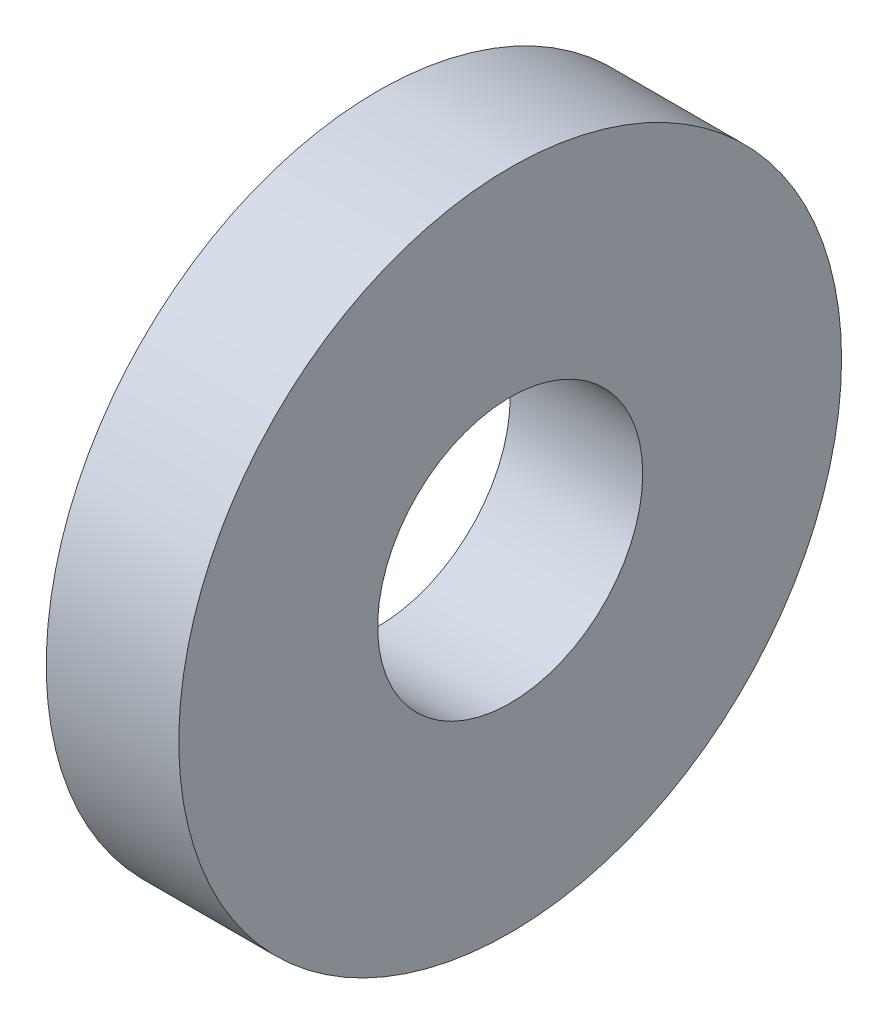
ISO-10303-21;
HEADER;
FILE_DESCRIPTION(('STEP AP214'),'2;1');
FILE_NAME('part.step','',(''),(''),'','','');
FILE_SCHEMA(('AUTOMOTIVE_DESIGN { 1 0 10303 214 1 1 1 1 }'));
ENDSEC;
DATA;
#1=APPLICATION_CONTEXT('core data for automotive mechanical design processes');
#2=APPLICATION_PROTOCOL_DEFINITION('international standard','automotive_design',2000,#1);
#3=PRODUCT_CONTEXT('',#1,'mechanical');
#4=PRODUCT('Part','Part','',(#3));
#5=PRODUCT_RELATED_PRODUCT_CATEGORY('part','',(#4));
#6=PRODUCT_DEFINITION_FORMATION('','',#4);
#7=PRODUCT_DEFINITION_CONTEXT('part definition',#1,'design');
#8=PRODUCT_DEFINITION('design','',#6,#7);
#9=PRODUCT_DEFINITION_SHAPE('','',#8);
#10=(LENGTH_UNIT() NAMED_UNIT(*) SI_UNIT(.MILLI.,.METRE.));
#11=(NAMED_UNIT(*) PLANE_ANGLE_UNIT() SI_UNIT($,.RADIAN.));
#12=(NAMED_UNIT(*) SI_UNIT($,.STERADIAN.) SOLID_ANGLE_UNIT());
#13=UNCERTAINTY_MEASURE_WITH_UNIT(LENGTH_MEASURE(1.E-05),#10,'distance_accuracy_value','');
#14=(GEOMETRIC_REPRESENTATION_CONTEXT(3) GLOBAL_UNCERTAINTY_ASSIGNED_CONTEXT((#13)) GLOBAL_UNIT_ASSIGNED_CONTEXT((#10,
#11,#12)) REPRESENTATION_CONTEXT('',''));
#15=CARTESIAN_POINT('',(0.,0.,0.));
#16=DIRECTION('',(0.,0.,1.));
#17=DIRECTION('',(1.,0.,0.));
#18=AXIS2_PLACEMENT_3D('',#15,#16,#17);
#19=CARTESIAN_POINT('',(2.5,0.,0.));
#20=DIRECTION('',(1.,0.,0.));
#21=DIRECTION('',(0.,0.,-1.));
#22=AXIS2_PLACEMENT_3D('',#19,#20,#21);
#23=PLANE('',#22);
#24=CARTESIAN_POINT('',(2.5,0.,0.));
#25=DIRECTION('',(1.,0.,0.));
#26=DIRECTION('',(0.,0.,-1.));
#27=AXIS2_PLACEMENT_3D('',#24,#25,#26);
#28=CIRCLE('',#27,12.5);
#29=CARTESIAN_POINT('',(2.5,0.,-12.5));
#30=VERTEX_POINT('',#29);
#31=EDGE_CURVE('E10',#30,#30,#28,.T.);
#32=ORIENTED_EDGE('',*,*,#31,.T.);
#33=EDGE_LOOP('',(#32));
#34=FACE_BOUND('',#33,.T.);
#35=CARTESIAN_POINT('',(2.5,0.,0.));
#36=DIRECTION('',(1.,0.,0.));
#37=DIRECTION('',(0.,0.,-1.));
#38=AXIS2_PLACEMENT_3D('',#35,#36,#37);
#39=CIRCLE('',#38,5.);
#40=CARTESIAN_POINT('',(2.5,0.,-5.));
#41=VERTEX_POINT('',#40);
#42=EDGE_CURVE('E42',#41,#41,#39,.T.);
#43=ORIENTED_EDGE('',*,*,#42,.F.);
#44=EDGE_LOOP('',(#43));
#45=FACE_BOUND('',#44,.T.);
#46=ADVANCED_FACE('F31',(#34,#45),#23,.T.);
#47=CARTESIAN_POINT('',(-2.5,0.,0.));
#48=DIRECTION('',(1.,0.,0.));
#49=DIRECTION('',(0.,0.,-1.));
#50=AXIS2_PLACEMENT_3D('',#47,#48,#49);
#51=PLANE('',#50);
#52=CARTESIAN_POINT('',(-2.5,0.,0.));
#53=DIRECTION('',(1.,0.,0.));
#54=DIRECTION('',(0.,0.,-1.));
#55=AXIS2_PLACEMENT_3D('',#52,#53,#54);
#56=CIRCLE('',#55,12.5);
#57=CARTESIAN_POINT('',(-2.5,0.,-12.5));
#58=VERTEX_POINT('',#57);
#59=EDGE_CURVE('E35',#58,#58,#56,.T.);
#60=ORIENTED_EDGE('',*,*,#59,.F.);
#61=EDGE_LOOP('',(#60));
#62=FACE_BOUND('',#61,.T.);
#63=CARTESIAN_POINT('',(-2.5,0.,0.));
#64=DIRECTION('',(1.,0.,0.));
#65=DIRECTION('',(0.,0.,-1.));
#66=AXIS2_PLACEMENT_3D('',#63,#64,#65);
#67=CIRCLE('',#66,5.);
#68=CARTESIAN_POINT('',(-2.5,0.,-5.));
#69=VERTEX_POINT('',#68);
#70=EDGE_CURVE('E44',#69,#69,#67,.T.);
#71=ORIENTED_EDGE('',*,*,#70,.T.);
#72=EDGE_LOOP('',(#71));
#73=FACE_BOUND('',#72,.T.);
#74=ADVANCED_FACE('F54',(#62,#73),#51,.F.);
#75=CARTESIAN_POINT('',(2.5,0.,0.));
#76=DIRECTION('',(-1.,0.,0.));
#77=DIRECTION('',(0.,0.,1.));
#78=AXIS2_PLACEMENT_3D('',#75,#76,#77);
#79=CYLINDRICAL_SURFACE('',#78,12.5);
#80=ORIENTED_EDGE('',*,*,#31,.F.);
#81=EDGE_LOOP('',(#80));
#82=FACE_BOUND('',#81,.T.);
#83=ORIENTED_EDGE('',*,*,#59,.T.);
#84=EDGE_LOOP('',(#83));
#85=FACE_BOUND('',#84,.T.);
#86=ADVANCED_FACE('F33',(#82,#85),#79,.T.);
#87=CARTESIAN_POINT('',(2.5,0.,0.));
#88=DIRECTION('',(-1.,0.,0.));
#89=DIRECTION('',(0.,0.,1.));
#90=AXIS2_PLACEMENT_3D('',#87,#88,#89);
#91=CYLINDRICAL_SURFACE('',#90,5.);
#92=ORIENTED_EDGE('',*,*,#42,.T.);
#93=EDGE_LOOP('',(#92));
#94=FACE_BOUND('',#93,.T.);
#95=ORIENTED_EDGE('',*,*,#70,.F.);
#96=EDGE_LOOP('',(#95));
#97=FACE_BOUND('',#96,.T.);
#98=ADVANCED_FACE('F50',(#94,#97),#91,.F.);
#99=CLOSED_SHELL('',(#46,#74,#86,#98));
#100=MANIFOLD_SOLID_BREP('B2',#99);
#101=ADVANCED_BREP_SHAPE_REPRESENTATION('',(#18,#100),#14);
#102=SHAPE_DEFINITION_REPRESENTATION(#9,#101);
ENDSEC;
END-ISO-10303-21;
